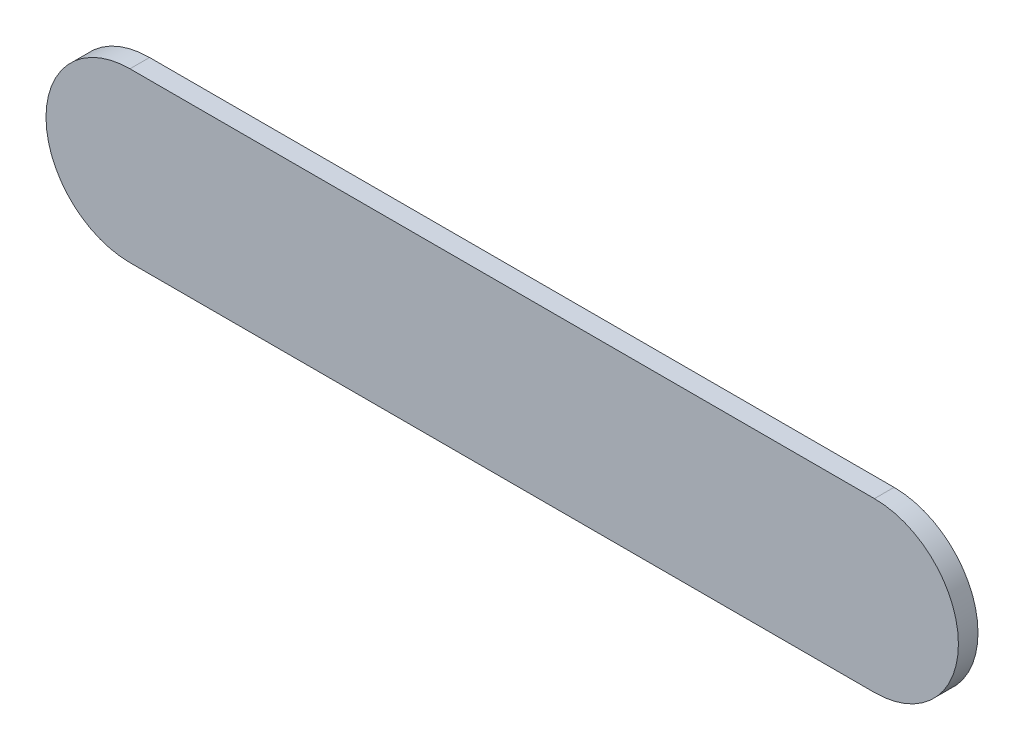
ISO-10303-21;
HEADER;
FILE_DESCRIPTION(('STEP AP214'),'2;1');
FILE_NAME('part.step','',(''),(''),'','','');
FILE_SCHEMA(('AUTOMOTIVE_DESIGN { 1 0 10303 214 1 1 1 1 }'));
ENDSEC;
DATA;
#1=APPLICATION_CONTEXT('core data for automotive mechanical design processes');
#2=APPLICATION_PROTOCOL_DEFINITION('international standard','automotive_design',2000,#1);
#3=PRODUCT_CONTEXT('',#1,'mechanical');
#4=PRODUCT('Part','Part','',(#3));
#5=PRODUCT_RELATED_PRODUCT_CATEGORY('part','',(#4));
#6=PRODUCT_DEFINITION_FORMATION('','',#4);
#7=PRODUCT_DEFINITION_CONTEXT('part definition',#1,'design');
#8=PRODUCT_DEFINITION('design','',#6,#7);
#9=PRODUCT_DEFINITION_SHAPE('','',#8);
#10=(LENGTH_UNIT() NAMED_UNIT(*) SI_UNIT(.MILLI.,.METRE.));
#11=(NAMED_UNIT(*) PLANE_ANGLE_UNIT() SI_UNIT($,.RADIAN.));
#12=(NAMED_UNIT(*) SI_UNIT($,.STERADIAN.) SOLID_ANGLE_UNIT());
#13=UNCERTAINTY_MEASURE_WITH_UNIT(LENGTH_MEASURE(1.E-05),#10,'distance_accuracy_value','');
#14=(GEOMETRIC_REPRESENTATION_CONTEXT(3) GLOBAL_UNCERTAINTY_ASSIGNED_CONTEXT((#13)) GLOBAL_UNIT_ASSIGNED_CONTEXT((#10,
#11,#12)) REPRESENTATION_CONTEXT('',''));
#15=CARTESIAN_POINT('',(0.,0.,0.));
#16=DIRECTION('',(0.,0.,1.));
#17=DIRECTION('',(1.,0.,0.));
#18=AXIS2_PLACEMENT_3D('',#15,#16,#17);
#19=CARTESIAN_POINT('',(95.365,-70.165,1.635));
#20=DIRECTION('',(0.,0.,1.));
#21=DIRECTION('',(1.,0.,0.));
#22=AXIS2_PLACEMENT_3D('',#19,#20,#21);
#23=PLANE('',#22);
#24=DIRECTION('',(1.,0.,0.));
#25=VECTOR('',#24,1.);
#26=CARTESIAN_POINT('',(95.365,-70.165,1.635));
#27=LINE('',#26,#25);
#28=CARTESIAN_POINT('',(95.365,-70.165,1.635));
#29=VERTEX_POINT('',#28);
#30=CARTESIAN_POINT('',(96.695,-70.165,1.635));
#31=VERTEX_POINT('',#30);
#32=EDGE_CURVE('E81',#29,#31,#27,.T.);
#33=ORIENTED_EDGE('',*,*,#32,.T.);
#34=CARTESIAN_POINT('',(96.695,-70.015,1.635));
#35=DIRECTION('',(0.,0.,1.));
#36=DIRECTION('',(0.,-1.,0.));
#37=AXIS2_PLACEMENT_3D('',#34,#35,#36);
#38=CIRCLE('',#37,0.15);
#39=CARTESIAN_POINT('',(96.695,-69.865,1.635));
#40=VERTEX_POINT('',#39);
#41=EDGE_CURVE('E97',#31,#40,#38,.T.);
#42=ORIENTED_EDGE('',*,*,#41,.T.);
#43=DIRECTION('',(-1.,0.,0.));
#44=VECTOR('',#43,1.);
#45=CARTESIAN_POINT('',(96.695,-69.865,1.635));
#46=LINE('',#45,#44);
#47=CARTESIAN_POINT('',(95.365,-69.865,1.635));
#48=VERTEX_POINT('',#47);
#49=EDGE_CURVE('E74',#40,#48,#46,.T.);
#50=ORIENTED_EDGE('',*,*,#49,.T.);
#51=CARTESIAN_POINT('',(95.365,-70.015,1.635));
#52=DIRECTION('',(0.,0.,1.));
#53=DIRECTION('',(0.,1.,0.));
#54=AXIS2_PLACEMENT_3D('',#51,#52,#53);
#55=CIRCLE('',#54,0.15);
#56=EDGE_CURVE('E11',#48,#29,#55,.T.);
#57=ORIENTED_EDGE('',*,*,#56,.T.);
#58=EDGE_LOOP('',(#33,#42,#50,#57));
#59=FACE_BOUND('',#58,.T.);
#60=ADVANCED_FACE('F17',(#59),#23,.T.);
#61=CARTESIAN_POINT('',(95.365,-70.165,1.6));
#62=DIRECTION('',(0.,0.,1.));
#63=DIRECTION('',(1.,0.,0.));
#64=AXIS2_PLACEMENT_3D('',#61,#62,#63);
#65=PLANE('',#64);
#66=CARTESIAN_POINT('',(95.365,-70.015,1.6));
#67=DIRECTION('',(0.,0.,1.));
#68=DIRECTION('',(0.,1.,0.));
#69=AXIS2_PLACEMENT_3D('',#66,#67,#68);
#70=CIRCLE('',#69,0.15);
#71=CARTESIAN_POINT('',(95.365,-69.865,1.6));
#72=VERTEX_POINT('',#71);
#73=CARTESIAN_POINT('',(95.365,-70.165,1.6));
#74=VERTEX_POINT('',#73);
#75=EDGE_CURVE('E20',#72,#74,#70,.T.);
#76=ORIENTED_EDGE('',*,*,#75,.F.);
#77=DIRECTION('',(-1.,0.,0.));
#78=VECTOR('',#77,1.);
#79=CARTESIAN_POINT('',(96.695,-69.865,1.6));
#80=LINE('',#79,#78);
#81=CARTESIAN_POINT('',(96.695,-69.865,1.6));
#82=VERTEX_POINT('',#81);
#83=EDGE_CURVE('E101',#82,#72,#80,.T.);
#84=ORIENTED_EDGE('',*,*,#83,.F.);
#85=CARTESIAN_POINT('',(96.695,-70.015,1.6));
#86=DIRECTION('',(0.,0.,1.));
#87=DIRECTION('',(0.,-1.,0.));
#88=AXIS2_PLACEMENT_3D('',#85,#86,#87);
#89=CIRCLE('',#88,0.15);
#90=CARTESIAN_POINT('',(96.695,-70.165,1.6));
#91=VERTEX_POINT('',#90);
#92=EDGE_CURVE('E83',#91,#82,#89,.T.);
#93=ORIENTED_EDGE('',*,*,#92,.F.);
#94=DIRECTION('',(1.,0.,0.));
#95=VECTOR('',#94,1.);
#96=CARTESIAN_POINT('',(95.365,-70.165,1.6));
#97=LINE('',#96,#95);
#98=EDGE_CURVE('E79',#74,#91,#97,.T.);
#99=ORIENTED_EDGE('',*,*,#98,.F.);
#100=EDGE_LOOP('',(#76,#84,#93,#99));
#101=FACE_BOUND('',#100,.T.);
#102=ADVANCED_FACE('F85',(#101),#65,.F.);
#103=CARTESIAN_POINT('',(95.365,-70.015,1.6));
#104=DIRECTION('',(0.,0.,-1.));
#105=DIRECTION('',(0.,1.,0.));
#106=AXIS2_PLACEMENT_3D('',#103,#104,#105);
#107=CYLINDRICAL_SURFACE('',#106,0.15);
#108=ORIENTED_EDGE('',*,*,#75,.T.);
#109=DIRECTION('',(0.,0.,1.));
#110=VECTOR('',#109,1.);
#111=CARTESIAN_POINT('',(95.365,-70.165,1.6));
#112=LINE('',#111,#110);
#113=EDGE_CURVE('E68',#74,#29,#112,.T.);
#114=ORIENTED_EDGE('',*,*,#113,.T.);
#115=ORIENTED_EDGE('',*,*,#56,.F.);
#116=DIRECTION('',(0.,0.,1.));
#117=VECTOR('',#116,1.);
#118=CARTESIAN_POINT('',(95.365,-69.865,1.6));
#119=LINE('',#118,#117);
#120=EDGE_CURVE('E71',#72,#48,#119,.T.);
#121=ORIENTED_EDGE('',*,*,#120,.F.);
#122=EDGE_LOOP('',(#108,#114,#115,#121));
#123=FACE_BOUND('',#122,.T.);
#124=ADVANCED_FACE('F67',(#123),#107,.T.);
#125=CARTESIAN_POINT('',(96.695,-69.865,1.6));
#126=DIRECTION('',(0.,-1.,0.));
#127=DIRECTION('',(0.,0.,-1.));
#128=AXIS2_PLACEMENT_3D('',#125,#126,#127);
#129=PLANE('',#128);
#130=ORIENTED_EDGE('',*,*,#83,.T.);
#131=ORIENTED_EDGE('',*,*,#120,.T.);
#132=ORIENTED_EDGE('',*,*,#49,.F.);
#133=DIRECTION('',(0.,0.,1.));
#134=VECTOR('',#133,1.);
#135=CARTESIAN_POINT('',(96.695,-69.865,1.6));
#136=LINE('',#135,#134);
#137=EDGE_CURVE('E102',#82,#40,#136,.T.);
#138=ORIENTED_EDGE('',*,*,#137,.F.);
#139=EDGE_LOOP('',(#130,#131,#132,#138));
#140=FACE_BOUND('',#139,.T.);
#141=ADVANCED_FACE('F120',(#140),#129,.F.);
#142=CARTESIAN_POINT('',(96.695,-70.015,1.6));
#143=DIRECTION('',(0.,0.,-1.));
#144=DIRECTION('',(0.,-1.,0.));
#145=AXIS2_PLACEMENT_3D('',#142,#143,#144);
#146=CYLINDRICAL_SURFACE('',#145,0.15);
#147=ORIENTED_EDGE('',*,*,#92,.T.);
#148=ORIENTED_EDGE('',*,*,#137,.T.);
#149=ORIENTED_EDGE('',*,*,#41,.F.);
#150=DIRECTION('',(0.,0.,1.));
#151=VECTOR('',#150,1.);
#152=CARTESIAN_POINT('',(96.695,-70.165,1.6));
#153=LINE('',#152,#151);
#154=EDGE_CURVE('E89',#91,#31,#153,.T.);
#155=ORIENTED_EDGE('',*,*,#154,.F.);
#156=EDGE_LOOP('',(#147,#148,#149,#155));
#157=FACE_BOUND('',#156,.T.);
#158=ADVANCED_FACE('F122',(#157),#146,.T.);
#159=CARTESIAN_POINT('',(95.365,-70.165,1.6));
#160=DIRECTION('',(0.,1.,0.));
#161=DIRECTION('',(1.,0.,0.));
#162=AXIS2_PLACEMENT_3D('',#159,#160,#161);
#163=PLANE('',#162);
#164=ORIENTED_EDGE('',*,*,#98,.T.);
#165=ORIENTED_EDGE('',*,*,#154,.T.);
#166=ORIENTED_EDGE('',*,*,#32,.F.);
#167=ORIENTED_EDGE('',*,*,#113,.F.);
#168=EDGE_LOOP('',(#164,#165,#166,#167));
#169=FACE_BOUND('',#168,.T.);
#170=ADVANCED_FACE('F77',(#169),#163,.F.);
#171=CLOSED_SHELL('',(#60,#102,#124,#141,#158,#170));
#172=MANIFOLD_SOLID_BREP('B1',#171);
#173=ADVANCED_BREP_SHAPE_REPRESENTATION('',(#18,#172),#14);
#174=SHAPE_DEFINITION_REPRESENTATION(#9,#173);
ENDSEC;
END-ISO-10303-21;
